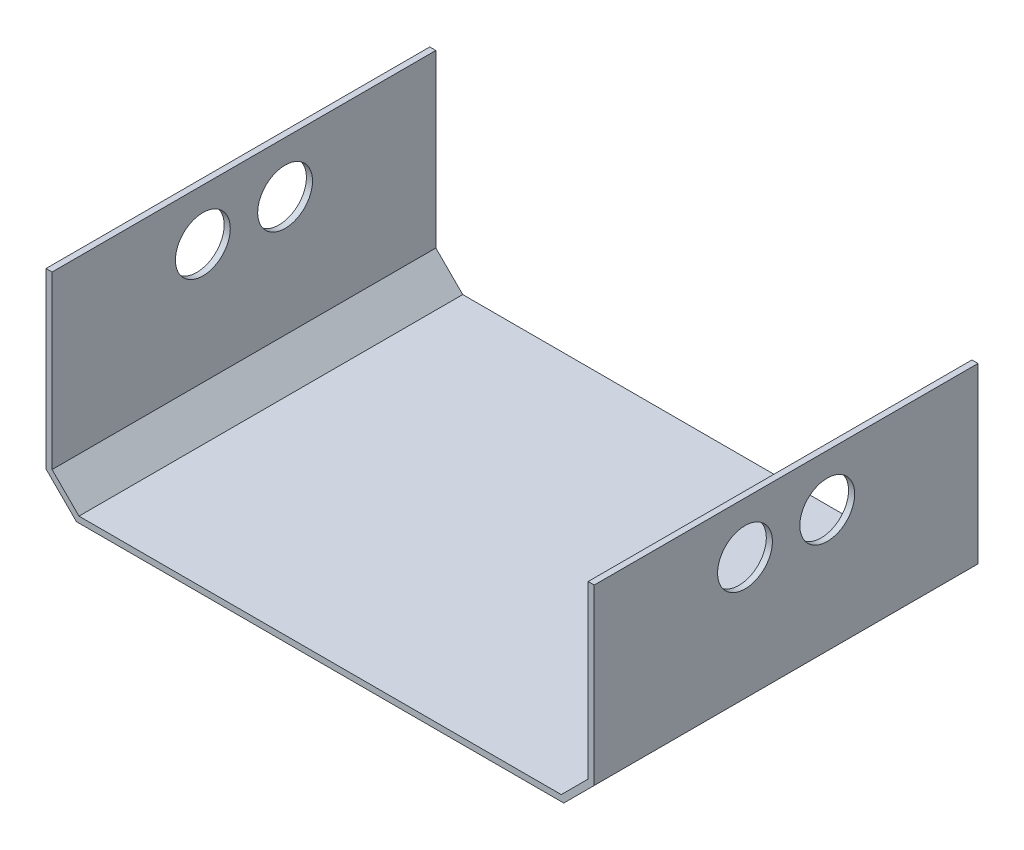
ISO-10303-21;
HEADER;
FILE_DESCRIPTION(('STEP AP214'),'2;1');
FILE_NAME('part.step','',(''),(''),'','','');
FILE_SCHEMA(('AUTOMOTIVE_DESIGN { 1 0 10303 214 1 1 1 1 }'));
ENDSEC;
DATA;
#1=APPLICATION_CONTEXT('core data for automotive mechanical design processes');
#2=APPLICATION_PROTOCOL_DEFINITION('international standard','automotive_design',2000,#1);
#3=PRODUCT_CONTEXT('',#1,'mechanical');
#4=PRODUCT('Part','Part','',(#3));
#5=PRODUCT_RELATED_PRODUCT_CATEGORY('part','',(#4));
#6=PRODUCT_DEFINITION_FORMATION('','',#4);
#7=PRODUCT_DEFINITION_CONTEXT('part definition',#1,'design');
#8=PRODUCT_DEFINITION('design','',#6,#7);
#9=PRODUCT_DEFINITION_SHAPE('','',#8);
#10=(LENGTH_UNIT() NAMED_UNIT(*) SI_UNIT(.MILLI.,.METRE.));
#11=(NAMED_UNIT(*) PLANE_ANGLE_UNIT() SI_UNIT($,.RADIAN.));
#12=(NAMED_UNIT(*) SI_UNIT($,.STERADIAN.) SOLID_ANGLE_UNIT());
#13=UNCERTAINTY_MEASURE_WITH_UNIT(LENGTH_MEASURE(1.E-05),#10,'distance_accuracy_value','');
#14=(GEOMETRIC_REPRESENTATION_CONTEXT(3) GLOBAL_UNCERTAINTY_ASSIGNED_CONTEXT((#13)) GLOBAL_UNIT_ASSIGNED_CONTEXT((#10,
#11,#12)) REPRESENTATION_CONTEXT('',''));
#15=CARTESIAN_POINT('',(0.,0.,0.));
#16=DIRECTION('',(0.,0.,1.));
#17=DIRECTION('',(1.,0.,0.));
#18=AXIS2_PLACEMENT_3D('',#15,#16,#17);
#19=CARTESIAN_POINT('',(0.,2.,126.));
#20=DIRECTION('',(0.,1.,0.));
#21=DIRECTION('',(0.,0.,1.));
#22=AXIS2_PLACEMENT_3D('',#19,#20,#21);
#23=PLANE('',#22);
#24=DIRECTION('',(1.,0.,0.));
#25=VECTOR('',#24,1.);
#26=CARTESIAN_POINT('',(0.,2.,126.));
#27=LINE('',#26,#25);
#28=CARTESIAN_POINT('',(0.828427124746164,2.,126.));
#29=VERTEX_POINT('',#28);
#30=CARTESIAN_POINT('',(159.171572875254,2.,126.));
#31=VERTEX_POINT('',#30);
#32=EDGE_CURVE('E25',#29,#31,#27,.T.);
#33=ORIENTED_EDGE('',*,*,#32,.T.);
#34=DIRECTION('',(0.,0.,1.));
#35=VECTOR('',#34,1.);
#36=CARTESIAN_POINT('',(159.171572875254,2.,0.));
#37=LINE('',#36,#35);
#38=CARTESIAN_POINT('',(159.171572875254,2.,0.));
#39=VERTEX_POINT('',#38);
#40=EDGE_CURVE('E32',#39,#31,#37,.T.);
#41=ORIENTED_EDGE('',*,*,#40,.F.);
#42=DIRECTION('',(-1.,0.,0.));
#43=VECTOR('',#42,1.);
#44=CARTESIAN_POINT('',(0.,2.,0.));
#45=LINE('',#44,#43);
#46=CARTESIAN_POINT('',(0.828427124746164,2.,0.));
#47=VERTEX_POINT('',#46);
#48=EDGE_CURVE('E11',#39,#47,#45,.T.);
#49=ORIENTED_EDGE('',*,*,#48,.T.);
#50=DIRECTION('',(0.,0.,1.));
#51=VECTOR('',#50,1.);
#52=CARTESIAN_POINT('',(0.828427124746164,2.,0.));
#53=LINE('',#52,#51);
#54=EDGE_CURVE('E172',#47,#29,#53,.T.);
#55=ORIENTED_EDGE('',*,*,#54,.T.);
#56=EDGE_LOOP('',(#33,#41,#49,#55));
#57=FACE_BOUND('',#56,.T.);
#58=ADVANCED_FACE('F16',(#57),#23,.T.);
#59=CARTESIAN_POINT('',(0.,2.,126.));
#60=DIRECTION('',(0.,0.,-1.));
#61=DIRECTION('',(-1.,0.,0.));
#62=AXIS2_PLACEMENT_3D('',#59,#60,#61);
#63=PLANE('',#62);
#64=DIRECTION('',(1.,0.,0.));
#65=VECTOR('',#64,1.);
#66=CARTESIAN_POINT('',(0.,0.,126.));
#67=LINE('',#66,#65);
#68=CARTESIAN_POINT('',(0.,0.,126.));
#69=VERTEX_POINT('',#68);
#70=CARTESIAN_POINT('',(160.,0.,126.));
#71=VERTEX_POINT('',#70);
#72=EDGE_CURVE('E118',#69,#71,#67,.T.);
#73=ORIENTED_EDGE('',*,*,#72,.T.);
#74=DIRECTION('',(0.707106781186548,0.707106781186548,0.));
#75=VECTOR('',#74,1.);
#76=CARTESIAN_POINT('',(61.9834979411081,-98.0165020588919,126.));
#77=LINE('',#76,#75);
#78=CARTESIAN_POINT('',(170.,9.99999999999972,126.));
#79=VERTEX_POINT('',#78);
#80=EDGE_CURVE('E117',#71,#79,#77,.T.);
#81=ORIENTED_EDGE('',*,*,#80,.T.);
#82=DIRECTION('',(0.,1.,0.));
#83=VECTOR('',#82,1.);
#84=CARTESIAN_POINT('',(170.,-116.033004117783,126.));
#85=LINE('',#84,#83);
#86=CARTESIAN_POINT('',(170.,67.,126.));
#87=VERTEX_POINT('',#86);
#88=EDGE_CURVE('E140',#79,#87,#85,.T.);
#89=ORIENTED_EDGE('',*,*,#88,.T.);
#90=DIRECTION('',(1.,0.,0.));
#91=VECTOR('',#90,1.);
#92=CARTESIAN_POINT('',(80.,67.,126.));
#93=LINE('',#92,#91);
#94=CARTESIAN_POINT('',(168.,67.,126.));
#95=VERTEX_POINT('',#94);
#96=EDGE_CURVE('E143',#95,#87,#93,.T.);
#97=ORIENTED_EDGE('',*,*,#96,.F.);
#98=DIRECTION('',(0.,1.,0.));
#99=VECTOR('',#98,1.);
#100=CARTESIAN_POINT('',(168.,-116.033004117784,126.));
#101=LINE('',#100,#99);
#102=CARTESIAN_POINT('',(168.,10.8284271247462,126.));
#103=VERTEX_POINT('',#102);
#104=EDGE_CURVE('E128',#103,#95,#101,.T.);
#105=ORIENTED_EDGE('',*,*,#104,.F.);
#106=DIRECTION('',(0.707106781186548,0.707106781186548,0.));
#107=VECTOR('',#106,1.);
#108=CARTESIAN_POINT('',(60.569284378735,-96.6022884965188,126.));
#109=LINE('',#108,#107);
#110=EDGE_CURVE('E135',#31,#103,#109,.T.);
#111=ORIENTED_EDGE('',*,*,#110,.F.);
#112=ORIENTED_EDGE('',*,*,#32,.F.);
#113=DIRECTION('',(-0.707106781186548,0.707106781186548,0.));
#114=VECTOR('',#113,1.);
#115=CARTESIAN_POINT('',(99.430715621265,-96.6022884965188,126.));
#116=LINE('',#115,#114);
#117=CARTESIAN_POINT('',(-8.,10.8284271247462,126.));
#118=VERTEX_POINT('',#117);
#119=EDGE_CURVE('E150',#29,#118,#116,.T.);
#120=ORIENTED_EDGE('',*,*,#119,.T.);
#121=DIRECTION('',(0.,1.,0.));
#122=VECTOR('',#121,1.);
#123=CARTESIAN_POINT('',(-8.,-116.033004117784,126.));
#124=LINE('',#123,#122);
#125=CARTESIAN_POINT('',(-8.,67.,126.));
#126=VERTEX_POINT('',#125);
#127=EDGE_CURVE('E175',#118,#126,#124,.T.);
#128=ORIENTED_EDGE('',*,*,#127,.T.);
#129=DIRECTION('',(1.,0.,0.));
#130=VECTOR('',#129,1.);
#131=CARTESIAN_POINT('',(80.,67.,126.));
#132=LINE('',#131,#130);
#133=CARTESIAN_POINT('',(-9.99999999999972,67.,126.));
#134=VERTEX_POINT('',#133);
#135=EDGE_CURVE('E178',#134,#126,#132,.T.);
#136=ORIENTED_EDGE('',*,*,#135,.F.);
#137=DIRECTION('',(0.,1.,0.));
#138=VECTOR('',#137,1.);
#139=CARTESIAN_POINT('',(-10.0000000000005,-116.033004117783,126.));
#140=LINE('',#139,#138);
#141=CARTESIAN_POINT('',(-9.99999999999973,9.99999999999973,126.));
#142=VERTEX_POINT('',#141);
#143=EDGE_CURVE('E181',#142,#134,#140,.T.);
#144=ORIENTED_EDGE('',*,*,#143,.F.);
#145=DIRECTION('',(-0.707106781186548,0.707106781186548,0.));
#146=VECTOR('',#145,1.);
#147=CARTESIAN_POINT('',(98.0165020588919,-98.0165020588919,126.));
#148=LINE('',#147,#146);
#149=EDGE_CURVE('E163',#69,#142,#148,.T.);
#150=ORIENTED_EDGE('',*,*,#149,.F.);
#151=EDGE_LOOP('',(#73,#81,#89,#97,#105,#111,#112,#120,#128,#136,#144,#150));
#152=FACE_BOUND('',#151,.T.);
#153=ADVANCED_FACE('F18',(#152),#63,.F.);
#154=CARTESIAN_POINT('',(0.,2.,0.));
#155=DIRECTION('',(0.,0.,1.));
#156=DIRECTION('',(1.,0.,0.));
#157=AXIS2_PLACEMENT_3D('',#154,#155,#156);
#158=PLANE('',#157);
#159=DIRECTION('',(0.707106781186548,0.707106781186548,0.));
#160=VECTOR('',#159,1.);
#161=CARTESIAN_POINT('',(61.9834979411081,-98.0165020588919,0.));
#162=LINE('',#161,#160);
#163=CARTESIAN_POINT('',(160.,0.,0.));
#164=VERTEX_POINT('',#163);
#165=CARTESIAN_POINT('',(170.,9.99999999999972,0.));
#166=VERTEX_POINT('',#165);
#167=EDGE_CURVE('E115',#164,#166,#162,.T.);
#168=ORIENTED_EDGE('',*,*,#167,.F.);
#169=DIRECTION('',(-1.,0.,0.));
#170=VECTOR('',#169,1.);
#171=CARTESIAN_POINT('',(0.,0.,0.));
#172=LINE('',#171,#170);
#173=CARTESIAN_POINT('',(0.,0.,0.));
#174=VERTEX_POINT('',#173);
#175=EDGE_CURVE('E20',#164,#174,#172,.T.);
#176=ORIENTED_EDGE('',*,*,#175,.T.);
#177=DIRECTION('',(-0.707106781186548,0.707106781186548,0.));
#178=VECTOR('',#177,1.);
#179=CARTESIAN_POINT('',(98.0165020588919,-98.0165020588919,0.));
#180=LINE('',#179,#178);
#181=CARTESIAN_POINT('',(-9.99999999999973,9.99999999999973,0.));
#182=VERTEX_POINT('',#181);
#183=EDGE_CURVE('E170',#174,#182,#180,.T.);
#184=ORIENTED_EDGE('',*,*,#183,.T.);
#185=DIRECTION('',(0.,1.,0.));
#186=VECTOR('',#185,1.);
#187=CARTESIAN_POINT('',(-10.0000000000005,-116.033004117783,0.));
#188=LINE('',#187,#186);
#189=CARTESIAN_POINT('',(-9.99999999999972,67.,0.));
#190=VERTEX_POINT('',#189);
#191=EDGE_CURVE('E168',#182,#190,#188,.T.);
#192=ORIENTED_EDGE('',*,*,#191,.T.);
#193=DIRECTION('',(1.,0.,0.));
#194=VECTOR('',#193,1.);
#195=CARTESIAN_POINT('',(80.,67.,0.));
#196=LINE('',#195,#194);
#197=CARTESIAN_POINT('',(-8.,67.,0.));
#198=VERTEX_POINT('',#197);
#199=EDGE_CURVE('E166',#190,#198,#196,.T.);
#200=ORIENTED_EDGE('',*,*,#199,.T.);
#201=DIRECTION('',(0.,1.,0.));
#202=VECTOR('',#201,1.);
#203=CARTESIAN_POINT('',(-8.,-116.033004117784,0.));
#204=LINE('',#203,#202);
#205=CARTESIAN_POINT('',(-8.,10.8284271247462,0.));
#206=VERTEX_POINT('',#205);
#207=EDGE_CURVE('E162',#206,#198,#204,.T.);
#208=ORIENTED_EDGE('',*,*,#207,.F.);
#209=DIRECTION('',(-0.707106781186548,0.707106781186548,0.));
#210=VECTOR('',#209,1.);
#211=CARTESIAN_POINT('',(99.430715621265,-96.6022884965188,0.));
#212=LINE('',#211,#210);
#213=EDGE_CURVE('E159',#47,#206,#212,.T.);
#214=ORIENTED_EDGE('',*,*,#213,.F.);
#215=ORIENTED_EDGE('',*,*,#48,.F.);
#216=DIRECTION('',(0.707106781186548,0.707106781186548,0.));
#217=VECTOR('',#216,1.);
#218=CARTESIAN_POINT('',(60.569284378735,-96.6022884965188,0.));
#219=LINE('',#218,#217);
#220=CARTESIAN_POINT('',(168.,10.8284271247462,0.));
#221=VERTEX_POINT('',#220);
#222=EDGE_CURVE('E123',#39,#221,#219,.T.);
#223=ORIENTED_EDGE('',*,*,#222,.T.);
#224=DIRECTION('',(0.,1.,0.));
#225=VECTOR('',#224,1.);
#226=CARTESIAN_POINT('',(168.,-116.033004117784,0.));
#227=LINE('',#226,#225);
#228=CARTESIAN_POINT('',(168.,67.,0.));
#229=VERTEX_POINT('',#228);
#230=EDGE_CURVE('E133',#221,#229,#227,.T.);
#231=ORIENTED_EDGE('',*,*,#230,.T.);
#232=DIRECTION('',(1.,0.,0.));
#233=VECTOR('',#232,1.);
#234=CARTESIAN_POINT('',(80.,67.,0.));
#235=LINE('',#234,#233);
#236=CARTESIAN_POINT('',(170.,67.,0.));
#237=VERTEX_POINT('',#236);
#238=EDGE_CURVE('E125',#229,#237,#235,.T.);
#239=ORIENTED_EDGE('',*,*,#238,.T.);
#240=DIRECTION('',(0.,1.,0.));
#241=VECTOR('',#240,1.);
#242=CARTESIAN_POINT('',(170.,-116.033004117783,0.));
#243=LINE('',#242,#241);
#244=EDGE_CURVE('E122',#166,#237,#243,.T.);
#245=ORIENTED_EDGE('',*,*,#244,.F.);
#246=EDGE_LOOP('',(#168,#176,#184,#192,#200,#208,#214,#215,#223,#231,#239,#245));
#247=FACE_BOUND('',#246,.T.);
#248=ADVANCED_FACE('F120',(#247),#158,.F.);
#249=CARTESIAN_POINT('',(0.,0.,126.));
#250=DIRECTION('',(0.,1.,0.));
#251=DIRECTION('',(0.,0.,1.));
#252=AXIS2_PLACEMENT_3D('',#249,#250,#251);
#253=PLANE('',#252);
#254=DIRECTION('',(0.,0.,1.));
#255=VECTOR('',#254,1.);
#256=CARTESIAN_POINT('',(0.,0.,0.));
#257=LINE('',#256,#255);
#258=EDGE_CURVE('E108',#174,#69,#257,.T.);
#259=ORIENTED_EDGE('',*,*,#258,.F.);
#260=ORIENTED_EDGE('',*,*,#175,.F.);
#261=DIRECTION('',(0.,0.,-1.));
#262=VECTOR('',#261,1.);
#263=CARTESIAN_POINT('',(160.,0.,126.));
#264=LINE('',#263,#262);
#265=EDGE_CURVE('E105',#71,#164,#264,.T.);
#266=ORIENTED_EDGE('',*,*,#265,.F.);
#267=ORIENTED_EDGE('',*,*,#72,.F.);
#268=EDGE_LOOP('',(#259,#260,#266,#267));
#269=FACE_BOUND('',#268,.T.);
#270=ADVANCED_FACE('F104',(#269),#253,.F.);
#271=CARTESIAN_POINT('',(98.0165020588919,-98.0165020588919,0.));
#272=DIRECTION('',(0.707106781186548,0.707106781186548,0.));
#273=DIRECTION('',(-0.707106781186548,0.707106781186548,0.));
#274=AXIS2_PLACEMENT_3D('',#271,#272,#273);
#275=PLANE('',#274);
#276=ORIENTED_EDGE('',*,*,#149,.T.);
#277=DIRECTION('',(0.,0.,1.));
#278=VECTOR('',#277,1.);
#279=CARTESIAN_POINT('',(-9.99999999999973,9.99999999999973,0.));
#280=LINE('',#279,#278);
#281=EDGE_CURVE('E184',#182,#142,#280,.T.);
#282=ORIENTED_EDGE('',*,*,#281,.F.);
#283=ORIENTED_EDGE('',*,*,#183,.F.);
#284=ORIENTED_EDGE('',*,*,#258,.T.);
#285=EDGE_LOOP('',(#276,#282,#283,#284));
#286=FACE_BOUND('',#285,.T.);
#287=ADVANCED_FACE('F201',(#286),#275,.F.);
#288=CARTESIAN_POINT('',(-10.0000000000005,-116.033004117783,0.));
#289=DIRECTION('',(1.,0.,0.));
#290=DIRECTION('',(0.,1.,0.));
#291=AXIS2_PLACEMENT_3D('',#288,#289,#290);
#292=PLANE('',#291);
#293=CARTESIAN_POINT('',(-10.,50.1397586974974,49.5));
#294=DIRECTION('',(1.,0.,0.));
#295=DIRECTION('',(0.,1.,0.));
#296=AXIS2_PLACEMENT_3D('',#293,#294,#295);
#297=CIRCLE('',#296,9.);
#298=CARTESIAN_POINT('',(-10.,59.1397586974974,49.5));
#299=VERTEX_POINT('',#298);
#300=EDGE_CURVE('E391',#299,#299,#297,.T.);
#301=ORIENTED_EDGE('',*,*,#300,.T.);
#302=EDGE_LOOP('',(#301));
#303=FACE_BOUND('',#302,.T.);
#304=CARTESIAN_POINT('',(-10.,50.1397586974974,76.5));
#305=DIRECTION('',(1.,0.,0.));
#306=DIRECTION('',(0.,1.,0.));
#307=AXIS2_PLACEMENT_3D('',#304,#305,#306);
#308=CIRCLE('',#307,9.);
#309=CARTESIAN_POINT('',(-10.,59.1397586974974,76.5));
#310=VERTEX_POINT('',#309);
#311=EDGE_CURVE('E402',#310,#310,#308,.T.);
#312=ORIENTED_EDGE('',*,*,#311,.T.);
#313=EDGE_LOOP('',(#312));
#314=FACE_BOUND('',#313,.T.);
#315=ORIENTED_EDGE('',*,*,#143,.T.);
#316=DIRECTION('',(0.,0.,1.));
#317=VECTOR('',#316,1.);
#318=CARTESIAN_POINT('',(-9.99999999999972,67.,0.));
#319=LINE('',#318,#317);
#320=EDGE_CURVE('E187',#190,#134,#319,.T.);
#321=ORIENTED_EDGE('',*,*,#320,.F.);
#322=ORIENTED_EDGE('',*,*,#191,.F.);
#323=ORIENTED_EDGE('',*,*,#281,.T.);
#324=EDGE_LOOP('',(#315,#321,#322,#323));
#325=FACE_BOUND('',#324,.T.);
#326=ADVANCED_FACE('F209',(#303,#314,#325),#292,.F.);
#327=CARTESIAN_POINT('',(80.,67.,0.));
#328=DIRECTION('',(0.,-1.,0.));
#329=DIRECTION('',(0.,0.,-1.));
#330=AXIS2_PLACEMENT_3D('',#327,#328,#329);
#331=PLANE('',#330);
#332=ORIENTED_EDGE('',*,*,#135,.T.);
#333=DIRECTION('',(0.,0.,1.));
#334=VECTOR('',#333,1.);
#335=CARTESIAN_POINT('',(-8.,67.,0.));
#336=LINE('',#335,#334);
#337=EDGE_CURVE('E190',#198,#126,#336,.T.);
#338=ORIENTED_EDGE('',*,*,#337,.F.);
#339=ORIENTED_EDGE('',*,*,#199,.F.);
#340=ORIENTED_EDGE('',*,*,#320,.T.);
#341=EDGE_LOOP('',(#332,#338,#339,#340));
#342=FACE_BOUND('',#341,.T.);
#343=ADVANCED_FACE('F212',(#342),#331,.F.);
#344=CARTESIAN_POINT('',(-8.,-116.033004117784,0.));
#345=DIRECTION('',(1.,0.,0.));
#346=DIRECTION('',(0.,0.,-1.));
#347=AXIS2_PLACEMENT_3D('',#344,#345,#346);
#348=PLANE('',#347);
#349=CARTESIAN_POINT('',(-8.,50.1397586974974,49.5));
#350=DIRECTION('',(1.,0.,0.));
#351=DIRECTION('',(0.,0.,-1.));
#352=AXIS2_PLACEMENT_3D('',#349,#350,#351);
#353=CIRCLE('',#352,9.);
#354=CARTESIAN_POINT('',(-8.,50.1397586974974,40.5));
#355=VERTEX_POINT('',#354);
#356=EDGE_CURVE('E388',#355,#355,#353,.T.);
#357=ORIENTED_EDGE('',*,*,#356,.F.);
#358=EDGE_LOOP('',(#357));
#359=FACE_BOUND('',#358,.T.);
#360=CARTESIAN_POINT('',(-8.,50.1397586974974,76.5));
#361=DIRECTION('',(1.,0.,0.));
#362=DIRECTION('',(0.,0.,-1.));
#363=AXIS2_PLACEMENT_3D('',#360,#361,#362);
#364=CIRCLE('',#363,9.);
#365=CARTESIAN_POINT('',(-8.,50.1397586974974,67.5));
#366=VERTEX_POINT('',#365);
#367=EDGE_CURVE('E138',#366,#366,#364,.T.);
#368=ORIENTED_EDGE('',*,*,#367,.F.);
#369=EDGE_LOOP('',(#368));
#370=FACE_BOUND('',#369,.T.);
#371=ORIENTED_EDGE('',*,*,#127,.F.);
#372=DIRECTION('',(0.,0.,1.));
#373=VECTOR('',#372,1.);
#374=CARTESIAN_POINT('',(-8.,10.8284271247462,0.));
#375=LINE('',#374,#373);
#376=EDGE_CURVE('E192',#206,#118,#375,.T.);
#377=ORIENTED_EDGE('',*,*,#376,.F.);
#378=ORIENTED_EDGE('',*,*,#207,.T.);
#379=ORIENTED_EDGE('',*,*,#337,.T.);
#380=EDGE_LOOP('',(#371,#377,#378,#379));
#381=FACE_BOUND('',#380,.T.);
#382=ADVANCED_FACE('F215',(#359,#370,#381),#348,.T.);
#383=CARTESIAN_POINT('',(99.430715621265,-96.6022884965188,0.));
#384=DIRECTION('',(0.707106781186548,0.707106781186548,0.));
#385=DIRECTION('',(-0.707106781186548,0.707106781186548,0.));
#386=AXIS2_PLACEMENT_3D('',#383,#384,#385);
#387=PLANE('',#386);
#388=ORIENTED_EDGE('',*,*,#119,.F.);
#389=ORIENTED_EDGE('',*,*,#54,.F.);
#390=ORIENTED_EDGE('',*,*,#213,.T.);
#391=ORIENTED_EDGE('',*,*,#376,.T.);
#392=EDGE_LOOP('',(#388,#389,#390,#391));
#393=FACE_BOUND('',#392,.T.);
#394=ADVANCED_FACE('F220',(#393),#387,.T.);
#395=CARTESIAN_POINT('',(60.569284378735,-96.6022884965188,0.));
#396=DIRECTION('',(0.707106781186548,-0.707106781186548,0.));
#397=DIRECTION('',(0.707106781186548,0.707106781186548,0.));
#398=AXIS2_PLACEMENT_3D('',#395,#396,#397);
#399=PLANE('',#398);
#400=ORIENTED_EDGE('',*,*,#110,.T.);
#401=DIRECTION('',(0.,0.,1.));
#402=VECTOR('',#401,1.);
#403=CARTESIAN_POINT('',(168.,10.8284271247462,0.));
#404=LINE('',#403,#402);
#405=EDGE_CURVE('E147',#221,#103,#404,.T.);
#406=ORIENTED_EDGE('',*,*,#405,.F.);
#407=ORIENTED_EDGE('',*,*,#222,.F.);
#408=ORIENTED_EDGE('',*,*,#40,.T.);
#409=EDGE_LOOP('',(#400,#406,#407,#408));
#410=FACE_BOUND('',#409,.T.);
#411=ADVANCED_FACE('F225',(#410),#399,.F.);
#412=CARTESIAN_POINT('',(168.,-116.033004117784,0.));
#413=DIRECTION('',(1.,0.,0.));
#414=DIRECTION('',(0.,0.,-1.));
#415=AXIS2_PLACEMENT_3D('',#412,#413,#414);
#416=PLANE('',#415);
#417=CARTESIAN_POINT('',(168.,50.1397586974981,49.5));
#418=DIRECTION('',(1.,0.,0.));
#419=DIRECTION('',(0.,0.,-1.));
#420=AXIS2_PLACEMENT_3D('',#417,#418,#419);
#421=CIRCLE('',#420,9.);
#422=CARTESIAN_POINT('',(168.,50.1397586974981,40.5));
#423=VERTEX_POINT('',#422);
#424=EDGE_CURVE('E392',#423,#423,#421,.T.);
#425=ORIENTED_EDGE('',*,*,#424,.T.);
#426=EDGE_LOOP('',(#425));
#427=FACE_BOUND('',#426,.T.);
#428=CARTESIAN_POINT('',(168.,50.1397586974981,76.5));
#429=DIRECTION('',(1.,0.,0.));
#430=DIRECTION('',(0.,0.,-1.));
#431=AXIS2_PLACEMENT_3D('',#428,#429,#430);
#432=CIRCLE('',#431,9.);
#433=CARTESIAN_POINT('',(168.,50.1397586974981,67.5));
#434=VERTEX_POINT('',#433);
#435=EDGE_CURVE('E405',#434,#434,#432,.T.);
#436=ORIENTED_EDGE('',*,*,#435,.T.);
#437=EDGE_LOOP('',(#436));
#438=FACE_BOUND('',#437,.T.);
#439=ORIENTED_EDGE('',*,*,#104,.T.);
#440=DIRECTION('',(0.,0.,1.));
#441=VECTOR('',#440,1.);
#442=CARTESIAN_POINT('',(168.,67.,0.));
#443=LINE('',#442,#441);
#444=EDGE_CURVE('E151',#229,#95,#443,.T.);
#445=ORIENTED_EDGE('',*,*,#444,.F.);
#446=ORIENTED_EDGE('',*,*,#230,.F.);
#447=ORIENTED_EDGE('',*,*,#405,.T.);
#448=EDGE_LOOP('',(#439,#445,#446,#447));
#449=FACE_BOUND('',#448,.T.);
#450=ADVANCED_FACE('F231',(#427,#438,#449),#416,.F.);
#451=CARTESIAN_POINT('',(80.,67.,0.));
#452=DIRECTION('',(0.,-1.,0.));
#453=DIRECTION('',(0.,0.,-1.));
#454=AXIS2_PLACEMENT_3D('',#451,#452,#453);
#455=PLANE('',#454);
#456=ORIENTED_EDGE('',*,*,#96,.T.);
#457=DIRECTION('',(0.,0.,1.));
#458=VECTOR('',#457,1.);
#459=CARTESIAN_POINT('',(170.,67.,0.));
#460=LINE('',#459,#458);
#461=EDGE_CURVE('E154',#237,#87,#460,.T.);
#462=ORIENTED_EDGE('',*,*,#461,.F.);
#463=ORIENTED_EDGE('',*,*,#238,.F.);
#464=ORIENTED_EDGE('',*,*,#444,.T.);
#465=EDGE_LOOP('',(#456,#462,#463,#464));
#466=FACE_BOUND('',#465,.T.);
#467=ADVANCED_FACE('F233',(#466),#455,.F.);
#468=CARTESIAN_POINT('',(170.,-116.033004117783,0.));
#469=DIRECTION('',(1.,0.,0.));
#470=DIRECTION('',(0.,1.,0.));
#471=AXIS2_PLACEMENT_3D('',#468,#469,#470);
#472=PLANE('',#471);
#473=CARTESIAN_POINT('',(170.,50.1397586974981,49.5));
#474=DIRECTION('',(1.,0.,0.));
#475=DIRECTION('',(0.,1.,0.));
#476=AXIS2_PLACEMENT_3D('',#473,#474,#475);
#477=CIRCLE('',#476,9.);
#478=CARTESIAN_POINT('',(170.,59.1397586974981,49.5));
#479=VERTEX_POINT('',#478);
#480=EDGE_CURVE('E393',#479,#479,#477,.T.);
#481=ORIENTED_EDGE('',*,*,#480,.F.);
#482=EDGE_LOOP('',(#481));
#483=FACE_BOUND('',#482,.T.);
#484=CARTESIAN_POINT('',(170.,50.1397586974981,76.5));
#485=DIRECTION('',(1.,0.,0.));
#486=DIRECTION('',(0.,1.,0.));
#487=AXIS2_PLACEMENT_3D('',#484,#485,#486);
#488=CIRCLE('',#487,9.);
#489=CARTESIAN_POINT('',(170.,59.1397586974981,76.5));
#490=VERTEX_POINT('',#489);
#491=EDGE_CURVE('E401',#490,#490,#488,.T.);
#492=ORIENTED_EDGE('',*,*,#491,.F.);
#493=EDGE_LOOP('',(#492));
#494=FACE_BOUND('',#493,.T.);
#495=ORIENTED_EDGE('',*,*,#88,.F.);
#496=DIRECTION('',(0.,0.,1.));
#497=VECTOR('',#496,1.);
#498=CARTESIAN_POINT('',(170.,9.99999999999972,0.));
#499=LINE('',#498,#497);
#500=EDGE_CURVE('E156',#166,#79,#499,.T.);
#501=ORIENTED_EDGE('',*,*,#500,.F.);
#502=ORIENTED_EDGE('',*,*,#244,.T.);
#503=ORIENTED_EDGE('',*,*,#461,.T.);
#504=EDGE_LOOP('',(#495,#501,#502,#503));
#505=FACE_BOUND('',#504,.T.);
#506=ADVANCED_FACE('F236',(#483,#494,#505),#472,.T.);
#507=CARTESIAN_POINT('',(61.9834979411081,-98.0165020588919,0.));
#508=DIRECTION('',(0.707106781186548,-0.707106781186548,0.));
#509=DIRECTION('',(0.707106781186548,0.707106781186548,0.));
#510=AXIS2_PLACEMENT_3D('',#507,#508,#509);
#511=PLANE('',#510);
#512=ORIENTED_EDGE('',*,*,#80,.F.);
#513=ORIENTED_EDGE('',*,*,#265,.T.);
#514=ORIENTED_EDGE('',*,*,#167,.T.);
#515=ORIENTED_EDGE('',*,*,#500,.T.);
#516=EDGE_LOOP('',(#512,#513,#514,#515));
#517=FACE_BOUND('',#516,.T.);
#518=ADVANCED_FACE('F114',(#517),#511,.T.);
#519=CARTESIAN_POINT('',(-10.,50.1397586974974,76.5));
#520=DIRECTION('',(1.,0.,0.));
#521=DIRECTION('',(0.,1.,0.));
#522=AXIS2_PLACEMENT_3D('',#519,#520,#521);
#523=CYLINDRICAL_SURFACE('',#522,9.);
#524=ORIENTED_EDGE('',*,*,#491,.T.);
#525=EDGE_LOOP('',(#524));
#526=FACE_BOUND('',#525,.T.);
#527=ORIENTED_EDGE('',*,*,#435,.F.);
#528=EDGE_LOOP('',(#527));
#529=FACE_BOUND('',#528,.T.);
#530=ADVANCED_FACE('F246',(#526,#529),#523,.F.);
#531=ORIENTED_EDGE('',*,*,#367,.T.);
#532=EDGE_LOOP('',(#531));
#533=FACE_BOUND('',#532,.T.);
#534=ORIENTED_EDGE('',*,*,#311,.F.);
#535=EDGE_LOOP('',(#534));
#536=FACE_BOUND('',#535,.T.);
#537=ADVANCED_FACE('F351',(#533,#536),#523,.F.);
#538=CARTESIAN_POINT('',(-10.,50.1397586974974,49.5));
#539=DIRECTION('',(1.,0.,0.));
#540=DIRECTION('',(0.,1.,0.));
#541=AXIS2_PLACEMENT_3D('',#538,#539,#540);
#542=CYLINDRICAL_SURFACE('',#541,9.);
#543=ORIENTED_EDGE('',*,*,#480,.T.);
#544=EDGE_LOOP('',(#543));
#545=FACE_BOUND('',#544,.T.);
#546=ORIENTED_EDGE('',*,*,#424,.F.);
#547=EDGE_LOOP('',(#546));
#548=FACE_BOUND('',#547,.T.);
#549=ADVANCED_FACE('F361',(#545,#548),#542,.F.);
#550=ORIENTED_EDGE('',*,*,#356,.T.);
#551=EDGE_LOOP('',(#550));
#552=FACE_BOUND('',#551,.T.);
#553=ORIENTED_EDGE('',*,*,#300,.F.);
#554=EDGE_LOOP('',(#553));
#555=FACE_BOUND('',#554,.T.);
#556=ADVANCED_FACE('F370',(#552,#555),#542,.F.);
#557=CLOSED_SHELL('',(#58,#153,#248,#270,#287,#326,#343,#382,#394,#411,#450,#467,#506,#518,#530,
#537,#549,#556));
#558=MANIFOLD_SOLID_BREP('B1',#557);
#559=ADVANCED_BREP_SHAPE_REPRESENTATION('',(#18,#558),#14);
#560=SHAPE_DEFINITION_REPRESENTATION(#9,#559);
ENDSEC;
END-ISO-10303-21;
